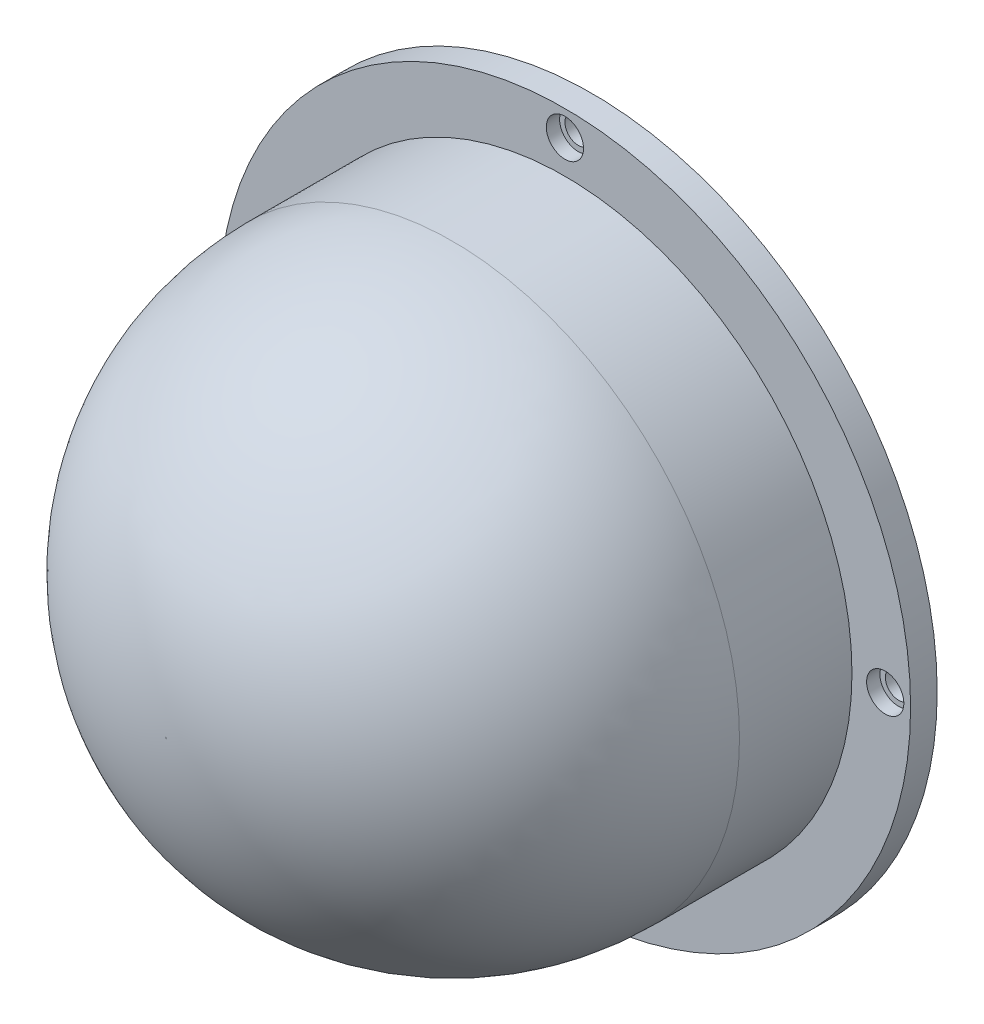
ISO-10303-21;
HEADER;
FILE_DESCRIPTION(('STEP AP214'),'2;1');
FILE_NAME('part.step','',(''),(''),'','','');
FILE_SCHEMA(('AUTOMOTIVE_DESIGN { 1 0 10303 214 1 1 1 1 }'));
ENDSEC;
DATA;
#1=APPLICATION_CONTEXT('core data for automotive mechanical design processes');
#2=APPLICATION_PROTOCOL_DEFINITION('international standard','automotive_design',2000,#1);
#3=PRODUCT_CONTEXT('',#1,'mechanical');
#4=PRODUCT('Part','Part','',(#3));
#5=PRODUCT_RELATED_PRODUCT_CATEGORY('part','',(#4));
#6=PRODUCT_DEFINITION_FORMATION('','',#4);
#7=PRODUCT_DEFINITION_CONTEXT('part definition',#1,'design');
#8=PRODUCT_DEFINITION('design','',#6,#7);
#9=PRODUCT_DEFINITION_SHAPE('','',#8);
#10=(LENGTH_UNIT() NAMED_UNIT(*) SI_UNIT(.MILLI.,.METRE.));
#11=(NAMED_UNIT(*) PLANE_ANGLE_UNIT() SI_UNIT($,.RADIAN.));
#12=(NAMED_UNIT(*) SI_UNIT($,.STERADIAN.) SOLID_ANGLE_UNIT());
#13=UNCERTAINTY_MEASURE_WITH_UNIT(LENGTH_MEASURE(1.E-05),#10,'distance_accuracy_value','');
#14=(GEOMETRIC_REPRESENTATION_CONTEXT(3) GLOBAL_UNCERTAINTY_ASSIGNED_CONTEXT((#13)) GLOBAL_UNIT_ASSIGNED_CONTEXT((#10,
#11,#12)) REPRESENTATION_CONTEXT('',''));
#15=CARTESIAN_POINT('',(0.,0.,0.));
#16=DIRECTION('',(0.,0.,1.));
#17=DIRECTION('',(1.,0.,0.));
#18=AXIS2_PLACEMENT_3D('',#15,#16,#17);
#19=CARTESIAN_POINT('',(60.2478467939616,6.31062698359791E-13,0.));
#20=DIRECTION('',(0.,0.,1.));
#21=DIRECTION('',(1.,0.,0.));
#22=AXIS2_PLACEMENT_3D('',#19,#20,#21);
#23=CYLINDRICAL_SURFACE('',#22,2.5);
#24=CARTESIAN_POINT('',(60.2478467939616,6.31062698359791E-13,0.));
#25=DIRECTION('',(0.,0.,1.));
#26=DIRECTION('',(0.,-1.,0.));
#27=AXIS2_PLACEMENT_3D('',#24,#25,#26);
#28=CIRCLE('',#27,2.5);
#29=CARTESIAN_POINT('',(60.2478467939616,-2.49999999999937,0.));
#30=VERTEX_POINT('',#29);
#31=EDGE_CURVE('E75',#30,#30,#28,.T.);
#32=ORIENTED_EDGE('',*,*,#31,.F.);
#33=EDGE_LOOP('',(#32));
#34=FACE_BOUND('',#33,.T.);
#35=CARTESIAN_POINT('',(60.2478467939616,6.31062698359791E-13,2.5));
#36=DIRECTION('',(0.,0.,1.));
#37=DIRECTION('',(1.,0.,0.));
#38=AXIS2_PLACEMENT_3D('',#35,#36,#37);
#39=CIRCLE('',#38,2.5);
#40=CARTESIAN_POINT('',(62.7478467939616,6.31062698359791E-13,2.5));
#41=VERTEX_POINT('',#40);
#42=EDGE_CURVE('E49',#41,#41,#39,.F.);
#43=ORIENTED_EDGE('',*,*,#42,.F.);
#44=EDGE_LOOP('',(#43));
#45=FACE_BOUND('',#44,.T.);
#46=ADVANCED_FACE('F45',(#34,#45),#23,.F.);
#47=CARTESIAN_POINT('',(0.,-60.2478467939616,0.));
#48=DIRECTION('',(0.,0.,1.));
#49=DIRECTION('',(1.,0.,0.));
#50=AXIS2_PLACEMENT_3D('',#47,#48,#49);
#51=CYLINDRICAL_SURFACE('',#50,2.5);
#52=CARTESIAN_POINT('',(0.,-60.2478467939616,0.));
#53=DIRECTION('',(0.,0.,1.));
#54=DIRECTION('',(-1.,0.,0.));
#55=AXIS2_PLACEMENT_3D('',#52,#53,#54);
#56=CIRCLE('',#55,2.5);
#57=CARTESIAN_POINT('',(-2.5,-60.2478467939616,0.));
#58=VERTEX_POINT('',#57);
#59=EDGE_CURVE('E79',#58,#58,#56,.T.);
#60=ORIENTED_EDGE('',*,*,#59,.F.);
#61=EDGE_LOOP('',(#60));
#62=FACE_BOUND('',#61,.T.);
#63=CARTESIAN_POINT('',(0.,-60.2478467939616,2.5));
#64=DIRECTION('',(0.,0.,1.));
#65=DIRECTION('',(1.,0.,0.));
#66=AXIS2_PLACEMENT_3D('',#63,#64,#65);
#67=CIRCLE('',#66,2.5);
#68=CARTESIAN_POINT('',(2.5,-60.2478467939616,2.5));
#69=VERTEX_POINT('',#68);
#70=EDGE_CURVE('E69',#69,#69,#67,.F.);
#71=ORIENTED_EDGE('',*,*,#70,.F.);
#72=EDGE_LOOP('',(#71));
#73=FACE_BOUND('',#72,.T.);
#74=ADVANCED_FACE('F131',(#62,#73),#51,.F.);
#75=CARTESIAN_POINT('',(-60.2478467939616,-2.10354232786597E-13,0.));
#76=DIRECTION('',(0.,0.,1.));
#77=DIRECTION('',(1.,0.,0.));
#78=AXIS2_PLACEMENT_3D('',#75,#76,#77);
#79=CYLINDRICAL_SURFACE('',#78,2.5);
#80=CARTESIAN_POINT('',(-60.2478467939616,-2.10354232786597E-13,0.));
#81=DIRECTION('',(0.,0.,1.));
#82=DIRECTION('',(0.,1.,0.));
#83=AXIS2_PLACEMENT_3D('',#80,#81,#82);
#84=CIRCLE('',#83,2.5);
#85=CARTESIAN_POINT('',(-60.2478467939616,2.49999999999979,0.));
#86=VERTEX_POINT('',#85);
#87=EDGE_CURVE('E84',#86,#86,#84,.T.);
#88=ORIENTED_EDGE('',*,*,#87,.F.);
#89=EDGE_LOOP('',(#88));
#90=FACE_BOUND('',#89,.T.);
#91=CARTESIAN_POINT('',(-60.2478467939616,-2.10354232786597E-13,2.5));
#92=DIRECTION('',(0.,0.,1.));
#93=DIRECTION('',(1.,0.,0.));
#94=AXIS2_PLACEMENT_3D('',#91,#92,#93);
#95=CIRCLE('',#94,2.5);
#96=CARTESIAN_POINT('',(-57.7478467939616,-2.10354232786597E-13,2.5));
#97=VERTEX_POINT('',#96);
#98=EDGE_CURVE('E67',#97,#97,#95,.F.);
#99=ORIENTED_EDGE('',*,*,#98,.F.);
#100=EDGE_LOOP('',(#99));
#101=FACE_BOUND('',#100,.T.);
#102=ADVANCED_FACE('F138',(#90,#101),#79,.F.);
#103=CARTESIAN_POINT('',(0.,60.2478467939616,0.));
#104=DIRECTION('',(0.,0.,1.));
#105=DIRECTION('',(1.,0.,0.));
#106=AXIS2_PLACEMENT_3D('',#103,#104,#105);
#107=CYLINDRICAL_SURFACE('',#106,2.5);
#108=CARTESIAN_POINT('',(0.,60.2478467939616,0.));
#109=DIRECTION('',(0.,0.,1.));
#110=DIRECTION('',(1.,0.,0.));
#111=AXIS2_PLACEMENT_3D('',#108,#109,#110);
#112=CIRCLE('',#111,2.5);
#113=CARTESIAN_POINT('',(2.5,60.2478467939616,0.));
#114=VERTEX_POINT('',#113);
#115=EDGE_CURVE('E65',#114,#114,#112,.T.);
#116=ORIENTED_EDGE('',*,*,#115,.F.);
#117=EDGE_LOOP('',(#116));
#118=FACE_BOUND('',#117,.T.);
#119=CARTESIAN_POINT('',(0.,60.2478467939616,2.5));
#120=DIRECTION('',(0.,0.,1.));
#121=DIRECTION('',(1.,0.,0.));
#122=AXIS2_PLACEMENT_3D('',#119,#120,#121);
#123=CIRCLE('',#122,2.5);
#124=CARTESIAN_POINT('',(2.5,60.2478467939616,2.5));
#125=VERTEX_POINT('',#124);
#126=EDGE_CURVE('E62',#125,#125,#123,.F.);
#127=ORIENTED_EDGE('',*,*,#126,.F.);
#128=EDGE_LOOP('',(#127));
#129=FACE_BOUND('',#128,.T.);
#130=ADVANCED_FACE('F153',(#118,#129),#107,.F.);
#131=CARTESIAN_POINT('',(0.,0.,5.));
#132=DIRECTION('',(0.,0.,-1.));
#133=DIRECTION('',(-1.,0.,0.));
#134=AXIS2_PLACEMENT_3D('',#131,#132,#133);
#135=CYLINDRICAL_SURFACE('',#134,65.);
#136=CARTESIAN_POINT('',(0.,0.,5.));
#137=DIRECTION('',(0.,0.,1.));
#138=DIRECTION('',(1.,0.,0.));
#139=AXIS2_PLACEMENT_3D('',#136,#137,#138);
#140=CIRCLE('',#139,65.);
#141=CARTESIAN_POINT('',(65.,0.,5.));
#142=VERTEX_POINT('',#141);
#143=EDGE_CURVE('E107',#142,#142,#140,.T.);
#144=ORIENTED_EDGE('',*,*,#143,.F.);
#145=EDGE_LOOP('',(#144));
#146=FACE_BOUND('',#145,.T.);
#147=CARTESIAN_POINT('',(0.,0.,0.));
#148=DIRECTION('',(0.,0.,1.));
#149=DIRECTION('',(1.,0.,0.));
#150=AXIS2_PLACEMENT_3D('',#147,#148,#149);
#151=CIRCLE('',#150,65.);
#152=CARTESIAN_POINT('',(65.,0.,0.));
#153=VERTEX_POINT('',#152);
#154=EDGE_CURVE('E102',#153,#153,#151,.T.);
#155=ORIENTED_EDGE('',*,*,#154,.T.);
#156=EDGE_LOOP('',(#155));
#157=FACE_BOUND('',#156,.T.);
#158=ADVANCED_FACE('F112',(#146,#157),#135,.T.);
#159=CARTESIAN_POINT('',(0.,0.,5.));
#160=DIRECTION('',(0.,0.,1.));
#161=DIRECTION('',(1.,0.,0.));
#162=AXIS2_PLACEMENT_3D('',#159,#160,#161);
#163=PLANE('',#162);
#164=CARTESIAN_POINT('',(-60.2236001036299,-2.10269575919775E-13,5.));
#165=DIRECTION('',(0.,0.,1.));
#166=DIRECTION('',(0.,1.,0.));
#167=AXIS2_PLACEMENT_3D('',#164,#165,#166);
#168=CIRCLE('',#167,3.5);
#169=CARTESIAN_POINT('',(-60.2236001036299,3.49999999999979,5.));
#170=VERTEX_POINT('',#169);
#171=EDGE_CURVE('E311',#170,#170,#168,.T.);
#172=ORIENTED_EDGE('',*,*,#171,.F.);
#173=EDGE_LOOP('',(#172));
#174=FACE_BOUND('',#173,.T.);
#175=CARTESIAN_POINT('',(0.,-60.2236001036299,5.));
#176=DIRECTION('',(0.,0.,1.));
#177=DIRECTION('',(-1.,0.,0.));
#178=AXIS2_PLACEMENT_3D('',#175,#176,#177);
#179=CIRCLE('',#178,3.5);
#180=CARTESIAN_POINT('',(-3.5,-60.2236001036299,5.));
#181=VERTEX_POINT('',#180);
#182=EDGE_CURVE('E299',#181,#181,#179,.T.);
#183=ORIENTED_EDGE('',*,*,#182,.F.);
#184=EDGE_LOOP('',(#183));
#185=FACE_BOUND('',#184,.T.);
#186=CARTESIAN_POINT('',(60.2236001036299,6.30808727759326E-13,5.));
#187=DIRECTION('',(0.,0.,1.));
#188=DIRECTION('',(0.,-1.,0.));
#189=AXIS2_PLACEMENT_3D('',#186,#187,#188);
#190=CIRCLE('',#189,3.5);
#191=CARTESIAN_POINT('',(60.22360010363,-3.49999999999937,5.));
#192=VERTEX_POINT('',#191);
#193=EDGE_CURVE('E296',#192,#192,#190,.T.);
#194=ORIENTED_EDGE('',*,*,#193,.F.);
#195=EDGE_LOOP('',(#194));
#196=FACE_BOUND('',#195,.T.);
#197=CARTESIAN_POINT('',(0.,60.2236001036299,5.));
#198=DIRECTION('',(0.,0.,1.));
#199=DIRECTION('',(1.,0.,0.));
#200=AXIS2_PLACEMENT_3D('',#197,#198,#199);
#201=CIRCLE('',#200,3.5);
#202=CARTESIAN_POINT('',(3.5,60.2236001036299,5.));
#203=VERTEX_POINT('',#202);
#204=EDGE_CURVE('E90',#203,#203,#201,.T.);
#205=ORIENTED_EDGE('',*,*,#204,.F.);
#206=EDGE_LOOP('',(#205));
#207=FACE_BOUND('',#206,.T.);
#208=CARTESIAN_POINT('',(0.,0.,5.));
#209=DIRECTION('',(0.,0.,1.));
#210=DIRECTION('',(1.,0.,0.));
#211=AXIS2_PLACEMENT_3D('',#208,#209,#210);
#212=CIRCLE('',#211,53.975);
#213=CARTESIAN_POINT('',(53.975,0.,5.));
#214=VERTEX_POINT('',#213);
#215=EDGE_CURVE('E58',#214,#214,#212,.T.);
#216=ORIENTED_EDGE('',*,*,#215,.F.);
#217=EDGE_LOOP('',(#216));
#218=FACE_BOUND('',#217,.T.);
#219=ORIENTED_EDGE('',*,*,#143,.T.);
#220=EDGE_LOOP('',(#219));
#221=FACE_BOUND('',#220,.T.);
#222=ADVANCED_FACE('F117',(#174,#185,#196,#207,#218,#221),#163,.T.);
#223=CARTESIAN_POINT('',(0.,0.,0.));
#224=DIRECTION('',(0.,0.,1.));
#225=DIRECTION('',(1.,0.,0.));
#226=AXIS2_PLACEMENT_3D('',#223,#224,#225);
#227=PLANE('',#226);
#228=ORIENTED_EDGE('',*,*,#87,.T.);
#229=EDGE_LOOP('',(#228));
#230=FACE_BOUND('',#229,.T.);
#231=ORIENTED_EDGE('',*,*,#59,.T.);
#232=EDGE_LOOP('',(#231));
#233=FACE_BOUND('',#232,.T.);
#234=ORIENTED_EDGE('',*,*,#31,.T.);
#235=EDGE_LOOP('',(#234));
#236=FACE_BOUND('',#235,.T.);
#237=ORIENTED_EDGE('',*,*,#115,.T.);
#238=EDGE_LOOP('',(#237));
#239=FACE_BOUND('',#238,.T.);
#240=CARTESIAN_POINT('',(0.,0.,0.));
#241=DIRECTION('',(0.,0.,1.));
#242=DIRECTION('',(1.,0.,0.));
#243=AXIS2_PLACEMENT_3D('',#240,#241,#242);
#244=CIRCLE('',#243,48.975);
#245=CARTESIAN_POINT('',(48.975,0.,0.));
#246=VERTEX_POINT('',#245);
#247=EDGE_CURVE('E95',#246,#246,#244,.T.);
#248=ORIENTED_EDGE('',*,*,#247,.T.);
#249=EDGE_LOOP('',(#248));
#250=FACE_BOUND('',#249,.T.);
#251=ORIENTED_EDGE('',*,*,#154,.F.);
#252=EDGE_LOOP('',(#251));
#253=FACE_BOUND('',#252,.T.);
#254=ADVANCED_FACE('F114',(#230,#233,#236,#239,#250,#253),#227,.F.);
#255=CARTESIAN_POINT('',(0.,0.,80.));
#256=DIRECTION('',(0.,0.,-1.));
#257=DIRECTION('',(-1.,0.,0.));
#258=AXIS2_PLACEMENT_3D('',#255,#256,#257);
#259=CYLINDRICAL_SURFACE('',#258,53.975);
#260=CARTESIAN_POINT('',(0.,0.,26.152));
#261=DIRECTION('',(0.,0.,1.));
#262=DIRECTION('',(1.,0.,0.));
#263=AXIS2_PLACEMENT_3D('',#260,#261,#262);
#264=CIRCLE('',#263,53.975);
#265=CARTESIAN_POINT('',(53.975,0.,26.152));
#266=VERTEX_POINT('',#265);
#267=EDGE_CURVE('E10',#266,#266,#264,.F.);
#268=ORIENTED_EDGE('',*,*,#267,.T.);
#269=EDGE_LOOP('',(#268));
#270=FACE_BOUND('',#269,.T.);
#271=ORIENTED_EDGE('',*,*,#215,.T.);
#272=EDGE_LOOP('',(#271));
#273=FACE_BOUND('',#272,.T.);
#274=ADVANCED_FACE('F116',(#270,#273),#259,.T.);
#275=CARTESIAN_POINT('',(0.,0.,80.));
#276=DIRECTION('',(0.,0.,1.));
#277=DIRECTION('',(1.,0.,0.));
#278=AXIS2_PLACEMENT_3D('',#275,#276,#277);
#279=PLANE('',#278);
#280=CARTESIAN_POINT('',(0.,0.,80.));
#281=DIRECTION('',(0.,0.,1.));
#282=DIRECTION('',(1.,0.,0.));
#283=AXIS2_PLACEMENT_3D('',#280,#281,#282);
#284=CIRCLE('',#283,0.126999999999995);
#285=CARTESIAN_POINT('',(0.126999999999995,0.,80.));
#286=VERTEX_POINT('',#285);
#287=EDGE_CURVE('E53',#286,#286,#284,.T.);
#288=ORIENTED_EDGE('',*,*,#287,.T.);
#289=EDGE_LOOP('',(#288));
#290=FACE_BOUND('',#289,.T.);
#291=ADVANCED_FACE('F124',(#290),#279,.T.);
#292=CARTESIAN_POINT('',(0.,0.,26.152));
#293=DIRECTION('',(0.,0.,1.));
#294=DIRECTION('',(1.,0.,0.));
#295=AXIS2_PLACEMENT_3D('',#292,#293,#294);
#296=DEGENERATE_TOROIDAL_SURFACE('',#295,0.126999999999995,53.848,.T.);
#297=ORIENTED_EDGE('',*,*,#267,.F.);
#298=EDGE_LOOP('',(#297));
#299=FACE_BOUND('',#298,.T.);
#300=ORIENTED_EDGE('',*,*,#287,.F.);
#301=EDGE_LOOP('',(#300));
#302=FACE_BOUND('',#301,.T.);
#303=ADVANCED_FACE('F47',(#299,#302),#296,.T.);
#304=CARTESIAN_POINT('',(0.,0.,80.));
#305=DIRECTION('',(0.,0.,-1.));
#306=DIRECTION('',(-1.,0.,0.));
#307=AXIS2_PLACEMENT_3D('',#304,#305,#306);
#308=CYLINDRICAL_SURFACE('',#307,48.975);
#309=CARTESIAN_POINT('',(0.,0.,26.152));
#310=DIRECTION('',(0.,0.,-1.));
#311=DIRECTION('',(-1.,0.,0.));
#312=AXIS2_PLACEMENT_3D('',#309,#310,#311);
#313=CIRCLE('',#312,48.975);
#314=CARTESIAN_POINT('',(-48.975,0.,26.152));
#315=VERTEX_POINT('',#314);
#316=EDGE_CURVE('E99',#315,#315,#313,.T.);
#317=ORIENTED_EDGE('',*,*,#316,.F.);
#318=EDGE_LOOP('',(#317));
#319=FACE_BOUND('',#318,.T.);
#320=ORIENTED_EDGE('',*,*,#247,.F.);
#321=EDGE_LOOP('',(#320));
#322=FACE_BOUND('',#321,.T.);
#323=ADVANCED_FACE('F157',(#319,#322),#308,.F.);
#324=CARTESIAN_POINT('',(0.,0.,75.));
#325=DIRECTION('',(0.,0.,1.));
#326=DIRECTION('',(1.,0.,0.));
#327=AXIS2_PLACEMENT_3D('',#324,#325,#326);
#328=PLANE('',#327);
#329=CARTESIAN_POINT('',(0.,0.,75.));
#330=DIRECTION('',(0.,0.,1.));
#331=DIRECTION('',(1.,0.,0.));
#332=AXIS2_PLACEMENT_3D('',#329,#330,#331);
#333=CIRCLE('',#332,0.126999999999998);
#334=CARTESIAN_POINT('',(0.126999999999998,0.,75.));
#335=VERTEX_POINT('',#334);
#336=EDGE_CURVE('E98',#335,#335,#333,.T.);
#337=ORIENTED_EDGE('',*,*,#336,.F.);
#338=EDGE_LOOP('',(#337));
#339=FACE_BOUND('',#338,.T.);
#340=ADVANCED_FACE('F160',(#339),#328,.F.);
#341=CARTESIAN_POINT('',(0.,0.,26.152));
#342=DIRECTION('',(0.,0.,1.));
#343=DIRECTION('',(1.,0.,0.));
#344=AXIS2_PLACEMENT_3D('',#341,#342,#343);
#345=DEGENERATE_TOROIDAL_SURFACE('',#344,0.126999999999995,48.848,.T.);
#346=ORIENTED_EDGE('',*,*,#316,.T.);
#347=EDGE_LOOP('',(#346));
#348=FACE_BOUND('',#347,.T.);
#349=ORIENTED_EDGE('',*,*,#336,.T.);
#350=EDGE_LOOP('',(#349));
#351=FACE_BOUND('',#350,.T.);
#352=ADVANCED_FACE('F148',(#348,#351),#345,.F.);
#353=CARTESIAN_POINT('',(0.,60.2236001036299,2.5));
#354=DIRECTION('',(0.,0.,1.));
#355=DIRECTION('',(1.,0.,0.));
#356=AXIS2_PLACEMENT_3D('',#353,#354,#355);
#357=PLANE('',#356);
#358=CARTESIAN_POINT('',(0.,60.2236001036299,2.5));
#359=DIRECTION('',(0.,0.,1.));
#360=DIRECTION('',(1.,0.,0.));
#361=AXIS2_PLACEMENT_3D('',#358,#359,#360);
#362=CIRCLE('',#361,3.5);
#363=CARTESIAN_POINT('',(3.5,60.2236001036299,2.5));
#364=VERTEX_POINT('',#363);
#365=EDGE_CURVE('E66',#364,#364,#362,.T.);
#366=ORIENTED_EDGE('',*,*,#365,.T.);
#367=EDGE_LOOP('',(#366));
#368=FACE_BOUND('',#367,.T.);
#369=ORIENTED_EDGE('',*,*,#126,.T.);
#370=EDGE_LOOP('',(#369));
#371=FACE_BOUND('',#370,.T.);
#372=ADVANCED_FACE('F144',(#368,#371),#357,.T.);
#373=CARTESIAN_POINT('',(0.,60.2236001036299,2.5));
#374=DIRECTION('',(0.,0.,1.));
#375=DIRECTION('',(1.,0.,0.));
#376=AXIS2_PLACEMENT_3D('',#373,#374,#375);
#377=CYLINDRICAL_SURFACE('',#376,3.5);
#378=ORIENTED_EDGE('',*,*,#365,.F.);
#379=EDGE_LOOP('',(#378));
#380=FACE_BOUND('',#379,.T.);
#381=ORIENTED_EDGE('',*,*,#204,.T.);
#382=EDGE_LOOP('',(#381));
#383=FACE_BOUND('',#382,.T.);
#384=ADVANCED_FACE('F147',(#380,#383),#377,.F.);
#385=CARTESIAN_POINT('',(-60.2236001036299,-2.10269575919775E-13,2.5));
#386=DIRECTION('',(0.,0.,1.));
#387=DIRECTION('',(0.,1.,0.));
#388=AXIS2_PLACEMENT_3D('',#385,#386,#387);
#389=PLANE('',#388);
#390=CARTESIAN_POINT('',(-60.2236001036299,-2.10269575919775E-13,2.5));
#391=DIRECTION('',(0.,0.,1.));
#392=DIRECTION('',(0.,1.,0.));
#393=AXIS2_PLACEMENT_3D('',#390,#391,#392);
#394=CIRCLE('',#393,3.5);
#395=CARTESIAN_POINT('',(-60.2236001036299,3.49999999999979,2.5));
#396=VERTEX_POINT('',#395);
#397=EDGE_CURVE('E70',#396,#396,#394,.T.);
#398=ORIENTED_EDGE('',*,*,#397,.T.);
#399=EDGE_LOOP('',(#398));
#400=FACE_BOUND('',#399,.T.);
#401=ORIENTED_EDGE('',*,*,#98,.T.);
#402=EDGE_LOOP('',(#401));
#403=FACE_BOUND('',#402,.T.);
#404=ADVANCED_FACE('F151',(#400,#403),#389,.T.);
#405=CARTESIAN_POINT('',(-60.2236001036299,-2.10269575919775E-13,2.5));
#406=DIRECTION('',(0.,0.,1.));
#407=DIRECTION('',(1.,0.,0.));
#408=AXIS2_PLACEMENT_3D('',#405,#406,#407);
#409=CYLINDRICAL_SURFACE('',#408,3.5);
#410=ORIENTED_EDGE('',*,*,#397,.F.);
#411=EDGE_LOOP('',(#410));
#412=FACE_BOUND('',#411,.T.);
#413=ORIENTED_EDGE('',*,*,#171,.T.);
#414=EDGE_LOOP('',(#413));
#415=FACE_BOUND('',#414,.T.);
#416=ADVANCED_FACE('F236',(#412,#415),#409,.F.);
#417=CARTESIAN_POINT('',(0.,-60.2236001036299,2.5));
#418=DIRECTION('',(0.,0.,1.));
#419=DIRECTION('',(-1.,0.,0.));
#420=AXIS2_PLACEMENT_3D('',#417,#418,#419);
#421=PLANE('',#420);
#422=CARTESIAN_POINT('',(0.,-60.2236001036299,2.5));
#423=DIRECTION('',(0.,0.,1.));
#424=DIRECTION('',(-1.,0.,0.));
#425=AXIS2_PLACEMENT_3D('',#422,#423,#424);
#426=CIRCLE('',#425,3.5);
#427=CARTESIAN_POINT('',(-3.5,-60.2236001036299,2.5));
#428=VERTEX_POINT('',#427);
#429=EDGE_CURVE('E308',#428,#428,#426,.T.);
#430=ORIENTED_EDGE('',*,*,#429,.T.);
#431=EDGE_LOOP('',(#430));
#432=FACE_BOUND('',#431,.T.);
#433=ORIENTED_EDGE('',*,*,#70,.T.);
#434=EDGE_LOOP('',(#433));
#435=FACE_BOUND('',#434,.T.);
#436=ADVANCED_FACE('F247',(#432,#435),#421,.T.);
#437=CARTESIAN_POINT('',(0.,-60.2236001036299,2.5));
#438=DIRECTION('',(0.,0.,1.));
#439=DIRECTION('',(1.,0.,0.));
#440=AXIS2_PLACEMENT_3D('',#437,#438,#439);
#441=CYLINDRICAL_SURFACE('',#440,3.5);
#442=ORIENTED_EDGE('',*,*,#429,.F.);
#443=EDGE_LOOP('',(#442));
#444=FACE_BOUND('',#443,.T.);
#445=ORIENTED_EDGE('',*,*,#182,.T.);
#446=EDGE_LOOP('',(#445));
#447=FACE_BOUND('',#446,.T.);
#448=ADVANCED_FACE('F257',(#444,#447),#441,.F.);
#449=CARTESIAN_POINT('',(60.2236001036299,6.30808727759326E-13,2.5));
#450=DIRECTION('',(0.,0.,1.));
#451=DIRECTION('',(0.,-1.,0.));
#452=AXIS2_PLACEMENT_3D('',#449,#450,#451);
#453=PLANE('',#452);
#454=CARTESIAN_POINT('',(60.2236001036299,6.30808727759326E-13,2.5));
#455=DIRECTION('',(0.,0.,1.));
#456=DIRECTION('',(0.,-1.,0.));
#457=AXIS2_PLACEMENT_3D('',#454,#455,#456);
#458=CIRCLE('',#457,3.5);
#459=CARTESIAN_POINT('',(60.22360010363,-3.49999999999937,2.5));
#460=VERTEX_POINT('',#459);
#461=EDGE_CURVE('E293',#460,#460,#458,.T.);
#462=ORIENTED_EDGE('',*,*,#461,.T.);
#463=EDGE_LOOP('',(#462));
#464=FACE_BOUND('',#463,.T.);
#465=ORIENTED_EDGE('',*,*,#42,.T.);
#466=EDGE_LOOP('',(#465));
#467=FACE_BOUND('',#466,.T.);
#468=ADVANCED_FACE('F267',(#464,#467),#453,.T.);
#469=CARTESIAN_POINT('',(60.2236001036299,6.30808727759326E-13,2.5));
#470=DIRECTION('',(0.,0.,1.));
#471=DIRECTION('',(1.,0.,0.));
#472=AXIS2_PLACEMENT_3D('',#469,#470,#471);
#473=CYLINDRICAL_SURFACE('',#472,3.5);
#474=ORIENTED_EDGE('',*,*,#461,.F.);
#475=EDGE_LOOP('',(#474));
#476=FACE_BOUND('',#475,.T.);
#477=ORIENTED_EDGE('',*,*,#193,.T.);
#478=EDGE_LOOP('',(#477));
#479=FACE_BOUND('',#478,.T.);
#480=ADVANCED_FACE('F277',(#476,#479),#473,.F.);
#481=CLOSED_SHELL('',(#46,#74,#102,#130,#158,#222,#254,#274,#291,#303,#323,#340,#352,#372,#384,
#404,#416,#436,#448,#468,#480));
#482=MANIFOLD_SOLID_BREP('B2',#481);
#483=ADVANCED_BREP_SHAPE_REPRESENTATION('',(#18,#482),#14);
#484=SHAPE_DEFINITION_REPRESENTATION(#9,#483);
ENDSEC;
END-ISO-10303-21;
